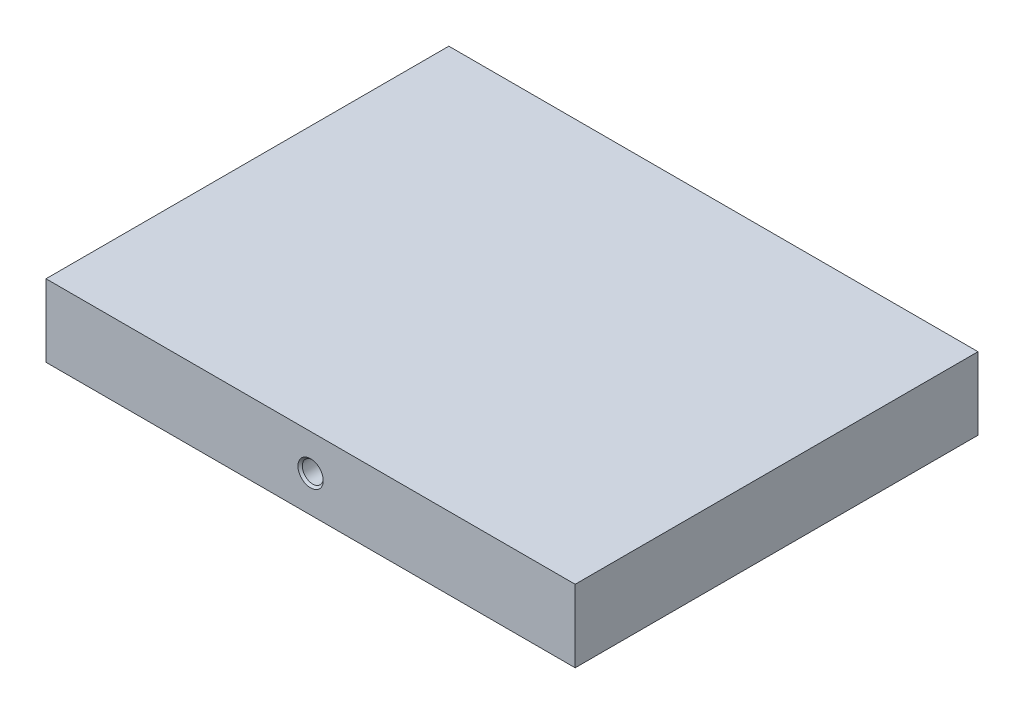
ISO-10303-21;
HEADER;
FILE_DESCRIPTION(('STEP AP214'),'2;1');
FILE_NAME('part.step','',(''),(''),'','','');
FILE_SCHEMA(('AUTOMOTIVE_DESIGN { 1 0 10303 214 1 1 1 1 }'));
ENDSEC;
DATA;
#1=APPLICATION_CONTEXT('core data for automotive mechanical design processes');
#2=APPLICATION_PROTOCOL_DEFINITION('international standard','automotive_design',2000,#1);
#3=PRODUCT_CONTEXT('',#1,'mechanical');
#4=PRODUCT('Part','Part','',(#3));
#5=PRODUCT_RELATED_PRODUCT_CATEGORY('part','',(#4));
#6=PRODUCT_DEFINITION_FORMATION('','',#4);
#7=PRODUCT_DEFINITION_CONTEXT('part definition',#1,'design');
#8=PRODUCT_DEFINITION('design','',#6,#7);
#9=PRODUCT_DEFINITION_SHAPE('','',#8);
#10=(LENGTH_UNIT() NAMED_UNIT(*) SI_UNIT(.MILLI.,.METRE.));
#11=(NAMED_UNIT(*) PLANE_ANGLE_UNIT() SI_UNIT($,.RADIAN.));
#12=(NAMED_UNIT(*) SI_UNIT($,.STERADIAN.) SOLID_ANGLE_UNIT());
#13=UNCERTAINTY_MEASURE_WITH_UNIT(LENGTH_MEASURE(1.E-05),#10,'distance_accuracy_value','');
#14=(GEOMETRIC_REPRESENTATION_CONTEXT(3) GLOBAL_UNCERTAINTY_ASSIGNED_CONTEXT((#13)) GLOBAL_UNIT_ASSIGNED_CONTEXT((#10,
#11,#12)) REPRESENTATION_CONTEXT('',''));
#15=CARTESIAN_POINT('',(0.,0.,0.));
#16=DIRECTION('',(0.,0.,1.));
#17=DIRECTION('',(1.,0.,0.));
#18=AXIS2_PLACEMENT_3D('',#15,#16,#17);
#19=CARTESIAN_POINT('',(-64.45,5.6,15.25));
#20=DIRECTION('',(1.,0.,0.));
#21=DIRECTION('',(0.,0.,-1.));
#22=AXIS2_PLACEMENT_3D('',#19,#20,#21);
#23=CYLINDRICAL_SURFACE('',#22,1.9);
#24=CARTESIAN_POINT('',(-64.45,5.6,15.25));
#25=DIRECTION('',(-1.,0.,0.));
#26=DIRECTION('',(0.,0.,1.));
#27=AXIS2_PLACEMENT_3D('',#24,#25,#26);
#28=CIRCLE('',#27,1.9);
#29=CARTESIAN_POINT('',(-64.45,5.6,17.15));
#30=VERTEX_POINT('',#29);
#31=EDGE_CURVE('E60',#30,#30,#28,.T.);
#32=ORIENTED_EDGE('',*,*,#31,.F.);
#33=EDGE_LOOP('',(#32));
#34=FACE_BOUND('',#33,.T.);
#35=CARTESIAN_POINT('',(-63.25,5.6,15.25));
#36=DIRECTION('',(-1.,0.,0.));
#37=DIRECTION('',(0.,0.,1.));
#38=AXIS2_PLACEMENT_3D('',#35,#36,#37);
#39=CIRCLE('',#38,1.9);
#40=CARTESIAN_POINT('',(-63.25,5.6,17.15));
#41=VERTEX_POINT('',#40);
#42=EDGE_CURVE('E11',#41,#41,#39,.T.);
#43=ORIENTED_EDGE('',*,*,#42,.T.);
#44=EDGE_LOOP('',(#43));
#45=FACE_BOUND('',#44,.T.);
#46=ADVANCED_FACE('F56',(#34,#45),#23,.T.);
#47=CARTESIAN_POINT('',(-64.45,5.6,15.25));
#48=DIRECTION('',(-1.,0.,0.));
#49=DIRECTION('',(0.,0.,1.));
#50=AXIS2_PLACEMENT_3D('',#47,#48,#49);
#51=PLANE('',#50);
#52=ORIENTED_EDGE('',*,*,#31,.T.);
#53=EDGE_LOOP('',(#52));
#54=FACE_BOUND('',#53,.T.);
#55=ADVANCED_FACE('F58',(#54),#51,.T.);
#56=CARTESIAN_POINT('',(-63.25,5.6,15.25));
#57=DIRECTION('',(-1.,0.,0.));
#58=DIRECTION('',(0.,0.,1.));
#59=AXIS2_PLACEMENT_3D('',#56,#57,#58);
#60=PLANE('',#59);
#61=ORIENTED_EDGE('',*,*,#42,.F.);
#62=EDGE_LOOP('',(#61));
#63=FACE_BOUND('',#62,.T.);
#64=ADVANCED_FACE('F75',(#63),#60,.F.);
#65=CLOSED_SHELL('',(#46,#55,#64));
#66=MANIFOLD_SOLID_BREP('B2',#65);
#67=CARTESIAN_POINT('',(-64.45,5.6,3.75000000000001));
#68=DIRECTION('',(1.,0.,0.));
#69=DIRECTION('',(0.,0.,-1.));
#70=AXIS2_PLACEMENT_3D('',#67,#68,#69);
#71=CYLINDRICAL_SURFACE('',#70,1.9);
#72=CARTESIAN_POINT('',(-64.45,5.6,3.75000000000001));
#73=DIRECTION('',(-1.,0.,0.));
#74=DIRECTION('',(0.,0.,1.));
#75=AXIS2_PLACEMENT_3D('',#72,#73,#74);
#76=CIRCLE('',#75,1.9);
#77=CARTESIAN_POINT('',(-64.45,5.6,5.65000000000001));
#78=VERTEX_POINT('',#77);
#79=EDGE_CURVE('E109',#78,#78,#76,.T.);
#80=ORIENTED_EDGE('',*,*,#79,.F.);
#81=EDGE_LOOP('',(#80));
#82=FACE_BOUND('',#81,.T.);
#83=CARTESIAN_POINT('',(-63.25,5.6,3.75000000000001));
#84=DIRECTION('',(-1.,0.,0.));
#85=DIRECTION('',(0.,0.,1.));
#86=AXIS2_PLACEMENT_3D('',#83,#84,#85);
#87=CIRCLE('',#86,1.9);
#88=CARTESIAN_POINT('',(-63.25,5.6,5.65000000000001));
#89=VERTEX_POINT('',#88);
#90=EDGE_CURVE('E55',#89,#89,#87,.T.);
#91=ORIENTED_EDGE('',*,*,#90,.T.);
#92=EDGE_LOOP('',(#91));
#93=FACE_BOUND('',#92,.T.);
#94=ADVANCED_FACE('F105',(#82,#93),#71,.T.);
#95=CARTESIAN_POINT('',(-64.45,5.6,3.75000000000001));
#96=DIRECTION('',(-1.,0.,0.));
#97=DIRECTION('',(0.,0.,1.));
#98=AXIS2_PLACEMENT_3D('',#95,#96,#97);
#99=PLANE('',#98);
#100=ORIENTED_EDGE('',*,*,#79,.T.);
#101=EDGE_LOOP('',(#100));
#102=FACE_BOUND('',#101,.T.);
#103=ADVANCED_FACE('F107',(#102),#99,.T.);
#104=CARTESIAN_POINT('',(-63.25,5.6,3.75000000000001));
#105=DIRECTION('',(-1.,0.,0.));
#106=DIRECTION('',(0.,0.,1.));
#107=AXIS2_PLACEMENT_3D('',#104,#105,#106);
#108=PLANE('',#107);
#109=ORIENTED_EDGE('',*,*,#90,.F.);
#110=EDGE_LOOP('',(#109));
#111=FACE_BOUND('',#110,.T.);
#112=ADVANCED_FACE('F124',(#111),#108,.F.);
#113=CLOSED_SHELL('',(#94,#103,#112));
#114=MANIFOLD_SOLID_BREP('B6',#113);
#115=CARTESIAN_POINT('',(-64.45,5.6,-7.74999999999999));
#116=DIRECTION('',(1.,0.,0.));
#117=DIRECTION('',(0.,0.,-1.));
#118=AXIS2_PLACEMENT_3D('',#115,#116,#117);
#119=CYLINDRICAL_SURFACE('',#118,1.9);
#120=CARTESIAN_POINT('',(-64.45,5.6,-7.74999999999999));
#121=DIRECTION('',(-1.,0.,0.));
#122=DIRECTION('',(0.,0.,1.));
#123=AXIS2_PLACEMENT_3D('',#120,#121,#122);
#124=CIRCLE('',#123,1.9);
#125=CARTESIAN_POINT('',(-64.45,5.6,-5.85));
#126=VERTEX_POINT('',#125);
#127=EDGE_CURVE('E158',#126,#126,#124,.T.);
#128=ORIENTED_EDGE('',*,*,#127,.F.);
#129=EDGE_LOOP('',(#128));
#130=FACE_BOUND('',#129,.T.);
#131=CARTESIAN_POINT('',(-63.25,5.6,-7.74999999999999));
#132=DIRECTION('',(-1.,0.,0.));
#133=DIRECTION('',(0.,0.,1.));
#134=AXIS2_PLACEMENT_3D('',#131,#132,#133);
#135=CIRCLE('',#134,1.9);
#136=CARTESIAN_POINT('',(-63.25,5.6,-5.85));
#137=VERTEX_POINT('',#136);
#138=EDGE_CURVE('E104',#137,#137,#135,.T.);
#139=ORIENTED_EDGE('',*,*,#138,.T.);
#140=EDGE_LOOP('',(#139));
#141=FACE_BOUND('',#140,.T.);
#142=ADVANCED_FACE('F154',(#130,#141),#119,.T.);
#143=CARTESIAN_POINT('',(-64.45,5.6,-7.74999999999999));
#144=DIRECTION('',(-1.,0.,0.));
#145=DIRECTION('',(0.,0.,1.));
#146=AXIS2_PLACEMENT_3D('',#143,#144,#145);
#147=PLANE('',#146);
#148=ORIENTED_EDGE('',*,*,#127,.T.);
#149=EDGE_LOOP('',(#148));
#150=FACE_BOUND('',#149,.T.);
#151=ADVANCED_FACE('F156',(#150),#147,.T.);
#152=CARTESIAN_POINT('',(-63.25,5.6,-7.74999999999999));
#153=DIRECTION('',(-1.,0.,0.));
#154=DIRECTION('',(0.,0.,1.));
#155=AXIS2_PLACEMENT_3D('',#152,#153,#154);
#156=PLANE('',#155);
#157=ORIENTED_EDGE('',*,*,#138,.F.);
#158=EDGE_LOOP('',(#157));
#159=FACE_BOUND('',#158,.T.);
#160=ADVANCED_FACE('F173',(#159),#156,.F.);
#161=CLOSED_SHELL('',(#142,#151,#160));
#162=MANIFOLD_SOLID_BREP('B50',#161);
#163=CARTESIAN_POINT('',(-64.45,5.6,-19.25));
#164=DIRECTION('',(1.,0.,0.));
#165=DIRECTION('',(0.,0.,-1.));
#166=AXIS2_PLACEMENT_3D('',#163,#164,#165);
#167=CYLINDRICAL_SURFACE('',#166,1.9);
#168=CARTESIAN_POINT('',(-64.45,5.6,-19.25));
#169=DIRECTION('',(-1.,0.,0.));
#170=DIRECTION('',(0.,0.,1.));
#171=AXIS2_PLACEMENT_3D('',#168,#169,#170);
#172=CIRCLE('',#171,1.9);
#173=CARTESIAN_POINT('',(-64.45,5.6,-17.35));
#174=VERTEX_POINT('',#173);
#175=EDGE_CURVE('E207',#174,#174,#172,.T.);
#176=ORIENTED_EDGE('',*,*,#175,.F.);
#177=EDGE_LOOP('',(#176));
#178=FACE_BOUND('',#177,.T.);
#179=CARTESIAN_POINT('',(-63.25,5.6,-19.25));
#180=DIRECTION('',(-1.,0.,0.));
#181=DIRECTION('',(0.,0.,1.));
#182=AXIS2_PLACEMENT_3D('',#179,#180,#181);
#183=CIRCLE('',#182,1.9);
#184=CARTESIAN_POINT('',(-63.25,5.6,-17.35));
#185=VERTEX_POINT('',#184);
#186=EDGE_CURVE('E153',#185,#185,#183,.T.);
#187=ORIENTED_EDGE('',*,*,#186,.T.);
#188=EDGE_LOOP('',(#187));
#189=FACE_BOUND('',#188,.T.);
#190=ADVANCED_FACE('F203',(#178,#189),#167,.T.);
#191=CARTESIAN_POINT('',(-64.45,5.6,-19.25));
#192=DIRECTION('',(-1.,0.,0.));
#193=DIRECTION('',(0.,0.,1.));
#194=AXIS2_PLACEMENT_3D('',#191,#192,#193);
#195=PLANE('',#194);
#196=ORIENTED_EDGE('',*,*,#175,.T.);
#197=EDGE_LOOP('',(#196));
#198=FACE_BOUND('',#197,.T.);
#199=ADVANCED_FACE('F205',(#198),#195,.T.);
#200=CARTESIAN_POINT('',(-63.25,5.6,-19.25));
#201=DIRECTION('',(-1.,0.,0.));
#202=DIRECTION('',(0.,0.,1.));
#203=AXIS2_PLACEMENT_3D('',#200,#201,#202);
#204=PLANE('',#203);
#205=ORIENTED_EDGE('',*,*,#186,.F.);
#206=EDGE_LOOP('',(#205));
#207=FACE_BOUND('',#206,.T.);
#208=ADVANCED_FACE('F222',(#207),#204,.F.);
#209=CLOSED_SHELL('',(#190,#199,#208));
#210=MANIFOLD_SOLID_BREP('B99',#209);
#211=CARTESIAN_POINT('',(-64.45,5.6,-30.75));
#212=DIRECTION('',(1.,0.,0.));
#213=DIRECTION('',(0.,0.,-1.));
#214=AXIS2_PLACEMENT_3D('',#211,#212,#213);
#215=CYLINDRICAL_SURFACE('',#214,1.9);
#216=CARTESIAN_POINT('',(-64.45,5.6,-30.75));
#217=DIRECTION('',(-1.,0.,0.));
#218=DIRECTION('',(0.,0.,1.));
#219=AXIS2_PLACEMENT_3D('',#216,#217,#218);
#220=CIRCLE('',#219,1.9);
#221=CARTESIAN_POINT('',(-64.45,5.6,-28.85));
#222=VERTEX_POINT('',#221);
#223=EDGE_CURVE('E202',#222,#222,#220,.T.);
#224=ORIENTED_EDGE('',*,*,#223,.F.);
#225=EDGE_LOOP('',(#224));
#226=FACE_BOUND('',#225,.T.);
#227=CARTESIAN_POINT('',(-63.25,5.6,-30.75));
#228=DIRECTION('',(-1.,0.,0.));
#229=DIRECTION('',(0.,0.,1.));
#230=AXIS2_PLACEMENT_3D('',#227,#228,#229);
#231=CIRCLE('',#230,1.9);
#232=CARTESIAN_POINT('',(-63.25,5.6,-28.85));
#233=VERTEX_POINT('',#232);
#234=EDGE_CURVE('E256',#233,#233,#231,.T.);
#235=ORIENTED_EDGE('',*,*,#234,.T.);
#236=EDGE_LOOP('',(#235));
#237=FACE_BOUND('',#236,.T.);
#238=ADVANCED_FACE('F253',(#226,#237),#215,.T.);
#239=CARTESIAN_POINT('',(-64.45,5.6,-30.75));
#240=DIRECTION('',(-1.,0.,0.));
#241=DIRECTION('',(0.,0.,1.));
#242=AXIS2_PLACEMENT_3D('',#239,#240,#241);
#243=PLANE('',#242);
#244=ORIENTED_EDGE('',*,*,#223,.T.);
#245=EDGE_LOOP('',(#244));
#246=FACE_BOUND('',#245,.T.);
#247=ADVANCED_FACE('F268',(#246),#243,.T.);
#248=CARTESIAN_POINT('',(-63.25,5.6,-30.75));
#249=DIRECTION('',(-1.,0.,0.));
#250=DIRECTION('',(0.,0.,1.));
#251=AXIS2_PLACEMENT_3D('',#248,#249,#250);
#252=PLANE('',#251);
#253=ORIENTED_EDGE('',*,*,#234,.F.);
#254=EDGE_LOOP('',(#253));
#255=FACE_BOUND('',#254,.T.);
#256=ADVANCED_FACE('F266',(#255),#252,.F.);
#257=CLOSED_SHELL('',(#238,#247,#256));
#258=MANIFOLD_SOLID_BREP('B148',#257);
#259=CARTESIAN_POINT('',(63.25,17.3,48.15));
#260=DIRECTION('',(-1.,0.,0.));
#261=DIRECTION('',(0.,0.,1.));
#262=AXIS2_PLACEMENT_3D('',#259,#260,#261);
#263=PLANE('',#262);
#264=DIRECTION('',(0.,0.,-1.));
#265=VECTOR('',#264,1.);
#266=CARTESIAN_POINT('',(63.25,0.,48.15));
#267=LINE('',#266,#265);
#268=CARTESIAN_POINT('',(63.25,0.,48.15));
#269=VERTEX_POINT('',#268);
#270=CARTESIAN_POINT('',(63.25,0.,-48.15));
#271=VERTEX_POINT('',#270);
#272=EDGE_CURVE('E460',#269,#271,#267,.T.);
#273=ORIENTED_EDGE('',*,*,#272,.T.);
#274=DIRECTION('',(0.,-1.,0.));
#275=VECTOR('',#274,1.);
#276=CARTESIAN_POINT('',(63.25,17.3,-48.15));
#277=LINE('',#276,#275);
#278=CARTESIAN_POINT('',(63.25,17.3,-48.15));
#279=VERTEX_POINT('',#278);
#280=EDGE_CURVE('E251',#279,#271,#277,.T.);
#281=ORIENTED_EDGE('',*,*,#280,.F.);
#282=DIRECTION('',(0.,0.,-1.));
#283=VECTOR('',#282,1.);
#284=CARTESIAN_POINT('',(63.25,17.3,48.15));
#285=LINE('',#284,#283);
#286=CARTESIAN_POINT('',(63.25,17.3,48.15));
#287=VERTEX_POINT('',#286);
#288=EDGE_CURVE('E461',#287,#279,#285,.T.);
#289=ORIENTED_EDGE('',*,*,#288,.F.);
#290=DIRECTION('',(0.,-1.,0.));
#291=VECTOR('',#290,1.);
#292=CARTESIAN_POINT('',(63.25,17.3,48.15));
#293=LINE('',#292,#291);
#294=EDGE_CURVE('E471',#287,#269,#293,.T.);
#295=ORIENTED_EDGE('',*,*,#294,.T.);
#296=EDGE_LOOP('',(#273,#281,#289,#295));
#297=FACE_BOUND('',#296,.T.);
#298=ADVANCED_FACE('F294',(#297),#263,.F.);
#299=CARTESIAN_POINT('',(-63.25,17.3,-48.15));
#300=DIRECTION('',(0.,0.,1.));
#301=DIRECTION('',(1.,0.,0.));
#302=AXIS2_PLACEMENT_3D('',#299,#300,#301);
#303=PLANE('',#302);
#304=DIRECTION('',(-1.,0.,0.));
#305=VECTOR('',#304,1.);
#306=CARTESIAN_POINT('',(-63.25,0.,-48.15));
#307=LINE('',#306,#305);
#308=CARTESIAN_POINT('',(-63.25,0.,-48.15));
#309=VERTEX_POINT('',#308);
#310=EDGE_CURVE('E475',#271,#309,#307,.T.);
#311=ORIENTED_EDGE('',*,*,#310,.T.);
#312=DIRECTION('',(0.,-1.,0.));
#313=VECTOR('',#312,1.);
#314=CARTESIAN_POINT('',(-63.25,17.3,-48.15));
#315=LINE('',#314,#313);
#316=CARTESIAN_POINT('',(-63.25,17.3,-48.15));
#317=VERTEX_POINT('',#316);
#318=EDGE_CURVE('E302',#317,#309,#315,.T.);
#319=ORIENTED_EDGE('',*,*,#318,.F.);
#320=DIRECTION('',(-1.,0.,0.));
#321=VECTOR('',#320,1.);
#322=CARTESIAN_POINT('',(-63.25,17.3,-48.15));
#323=LINE('',#322,#321);
#324=EDGE_CURVE('E346',#279,#317,#323,.T.);
#325=ORIENTED_EDGE('',*,*,#324,.F.);
#326=ORIENTED_EDGE('',*,*,#280,.T.);
#327=EDGE_LOOP('',(#311,#319,#325,#326));
#328=FACE_BOUND('',#327,.T.);
#329=ADVANCED_FACE('F511',(#328),#303,.F.);
#330=CARTESIAN_POINT('',(-63.25,17.3,48.15));
#331=DIRECTION('',(1.,0.,0.));
#332=DIRECTION('',(0.,0.,-1.));
#333=AXIS2_PLACEMENT_3D('',#330,#331,#332);
#334=PLANE('',#333);
#335=DIRECTION('',(0.,0.,-1.));
#336=VECTOR('',#335,1.);
#337=CARTESIAN_POINT('',(-63.25,7.35,22.75));
#338=LINE('',#337,#336);
#339=CARTESIAN_POINT('',(-63.25,7.35,31.75));
#340=VERTEX_POINT('',#339);
#341=CARTESIAN_POINT('',(-63.25,7.35,22.75));
#342=VERTEX_POINT('',#341);
#343=EDGE_CURVE('E426',#340,#342,#338,.T.);
#344=ORIENTED_EDGE('',*,*,#343,.F.);
#345=DIRECTION('',(0.,1.,0.));
#346=VECTOR('',#345,1.);
#347=CARTESIAN_POINT('',(-63.25,7.35,31.75));
#348=LINE('',#347,#346);
#349=CARTESIAN_POINT('',(-63.25,3.85,31.75));
#350=VERTEX_POINT('',#349);
#351=EDGE_CURVE('E309',#350,#340,#348,.T.);
#352=ORIENTED_EDGE('',*,*,#351,.F.);
#353=DIRECTION('',(0.,0.,1.));
#354=VECTOR('',#353,1.);
#355=CARTESIAN_POINT('',(-63.25,3.85,22.75));
#356=LINE('',#355,#354);
#357=CARTESIAN_POINT('',(-63.25,3.85,22.75));
#358=VERTEX_POINT('',#357);
#359=EDGE_CURVE('E411',#358,#350,#356,.T.);
#360=ORIENTED_EDGE('',*,*,#359,.F.);
#361=DIRECTION('',(0.,-1.,0.));
#362=VECTOR('',#361,1.);
#363=CARTESIAN_POINT('',(-63.25,7.35,22.75));
#364=LINE('',#363,#362);
#365=EDGE_CURVE('E430',#342,#358,#364,.T.);
#366=ORIENTED_EDGE('',*,*,#365,.F.);
#367=EDGE_LOOP('',(#344,#352,#360,#366));
#368=FACE_BOUND('',#367,.T.);
#369=DIRECTION('',(0.,0.,1.));
#370=VECTOR('',#369,1.);
#371=CARTESIAN_POINT('',(-63.25,0.,48.15));
#372=LINE('',#371,#370);
#373=CARTESIAN_POINT('',(-63.25,0.,48.15));
#374=VERTEX_POINT('',#373);
#375=EDGE_CURVE('E478',#309,#374,#372,.T.);
#376=ORIENTED_EDGE('',*,*,#375,.T.);
#377=DIRECTION('',(0.,-1.,0.));
#378=VECTOR('',#377,1.);
#379=CARTESIAN_POINT('',(-63.25,17.3,48.15));
#380=LINE('',#379,#378);
#381=CARTESIAN_POINT('',(-63.25,17.3,48.15));
#382=VERTEX_POINT('',#381);
#383=EDGE_CURVE('E485',#382,#374,#380,.T.);
#384=ORIENTED_EDGE('',*,*,#383,.F.);
#385=DIRECTION('',(0.,0.,1.));
#386=VECTOR('',#385,1.);
#387=CARTESIAN_POINT('',(-63.25,17.3,48.15));
#388=LINE('',#387,#386);
#389=EDGE_CURVE('E466',#317,#382,#388,.T.);
#390=ORIENTED_EDGE('',*,*,#389,.F.);
#391=ORIENTED_EDGE('',*,*,#318,.T.);
#392=EDGE_LOOP('',(#376,#384,#390,#391));
#393=FACE_BOUND('',#392,.T.);
#394=ADVANCED_FACE('F492',(#368,#393),#334,.F.);
#395=CARTESIAN_POINT('',(-63.25,17.3,48.15));
#396=DIRECTION('',(0.,0.,-1.));
#397=DIRECTION('',(-1.,0.,0.));
#398=AXIS2_PLACEMENT_3D('',#395,#396,#397);
#399=PLANE('',#398);
#400=CARTESIAN_POINT('',(0.,8.65,48.15));
#401=DIRECTION('',(0.,0.,1.));
#402=DIRECTION('',(1.,0.,0.));
#403=AXIS2_PLACEMENT_3D('',#400,#401,#402);
#404=CIRCLE('',#403,3.025);
#405=CARTESIAN_POINT('',(3.025,8.65,48.15));
#406=VERTEX_POINT('',#405);
#407=EDGE_CURVE('E440',#406,#406,#404,.T.);
#408=ORIENTED_EDGE('',*,*,#407,.F.);
#409=EDGE_LOOP('',(#408));
#410=FACE_BOUND('',#409,.T.);
#411=DIRECTION('',(1.,0.,0.));
#412=VECTOR('',#411,1.);
#413=CARTESIAN_POINT('',(-63.25,0.,48.15));
#414=LINE('',#413,#412);
#415=EDGE_CURVE('E339',#374,#269,#414,.T.);
#416=ORIENTED_EDGE('',*,*,#415,.T.);
#417=ORIENTED_EDGE('',*,*,#294,.F.);
#418=DIRECTION('',(1.,0.,0.));
#419=VECTOR('',#418,1.);
#420=CARTESIAN_POINT('',(-63.25,17.3,48.15));
#421=LINE('',#420,#419);
#422=EDGE_CURVE('E318',#382,#287,#421,.T.);
#423=ORIENTED_EDGE('',*,*,#422,.F.);
#424=ORIENTED_EDGE('',*,*,#383,.T.);
#425=EDGE_LOOP('',(#416,#417,#423,#424));
#426=FACE_BOUND('',#425,.T.);
#427=ADVANCED_FACE('F500',(#410,#426),#399,.F.);
#428=CARTESIAN_POINT('',(0.,17.3,0.));
#429=DIRECTION('',(0.,-1.,0.));
#430=DIRECTION('',(0.,0.,-1.));
#431=AXIS2_PLACEMENT_3D('',#428,#429,#430);
#432=PLANE('',#431);
#433=ORIENTED_EDGE('',*,*,#288,.T.);
#434=ORIENTED_EDGE('',*,*,#324,.T.);
#435=ORIENTED_EDGE('',*,*,#389,.T.);
#436=ORIENTED_EDGE('',*,*,#422,.T.);
#437=EDGE_LOOP('',(#433,#434,#435,#436));
#438=FACE_BOUND('',#437,.T.);
#439=ADVANCED_FACE('F502',(#438),#432,.F.);
#440=CARTESIAN_POINT('',(0.,0.,0.));
#441=DIRECTION('',(0.,-1.,0.));
#442=DIRECTION('',(0.,0.,-1.));
#443=AXIS2_PLACEMENT_3D('',#440,#441,#442);
#444=PLANE('',#443);
#445=CARTESIAN_POINT('',(37.5,0.,0.));
#446=DIRECTION('',(0.,-1.,0.));
#447=DIRECTION('',(0.,0.,-1.));
#448=AXIS2_PLACEMENT_3D('',#445,#446,#447);
#449=CIRCLE('',#448,2.025);
#450=CARTESIAN_POINT('',(37.5,0.,-2.02499999999999));
#451=VERTEX_POINT('',#450);
#452=EDGE_CURVE('E395',#451,#451,#449,.T.);
#453=ORIENTED_EDGE('',*,*,#452,.F.);
#454=EDGE_LOOP('',(#453));
#455=FACE_BOUND('',#454,.T.);
#456=CARTESIAN_POINT('',(-37.5,0.,0.));
#457=DIRECTION('',(0.,-1.,0.));
#458=DIRECTION('',(0.,0.,-1.));
#459=AXIS2_PLACEMENT_3D('',#456,#457,#458);
#460=CIRCLE('',#459,2.025);
#461=CARTESIAN_POINT('',(-37.5,0.,-2.025));
#462=VERTEX_POINT('',#461);
#463=EDGE_CURVE('E386',#462,#462,#460,.T.);
#464=ORIENTED_EDGE('',*,*,#463,.F.);
#465=EDGE_LOOP('',(#464));
#466=FACE_BOUND('',#465,.T.);
#467=ORIENTED_EDGE('',*,*,#272,.F.);
#468=ORIENTED_EDGE('',*,*,#415,.F.);
#469=ORIENTED_EDGE('',*,*,#375,.F.);
#470=ORIENTED_EDGE('',*,*,#310,.F.);
#471=EDGE_LOOP('',(#467,#468,#469,#470));
#472=FACE_BOUND('',#471,.T.);
#473=ADVANCED_FACE('F496',(#455,#466,#472),#444,.T.);
#474=CARTESIAN_POINT('',(0.,8.65,40.15));
#475=DIRECTION('',(0.,0.,1.));
#476=DIRECTION('',(1.,0.,0.));
#477=AXIS2_PLACEMENT_3D('',#474,#475,#476);
#478=CONICAL_SURFACE('',#477,2.5,1.02974425867665);
#479=CARTESIAN_POINT('',(0.,8.65,38.6478484524311));
#480=VERTEX_POINT('',#479);
#481=VERTEX_LOOP('',#480);
#482=FACE_BOUND('',#481,.T.);
#483=CARTESIAN_POINT('',(0.,8.65,40.15));
#484=DIRECTION('',(0.,0.,1.));
#485=DIRECTION('',(1.,0.,0.));
#486=AXIS2_PLACEMENT_3D('',#483,#484,#485);
#487=CIRCLE('',#486,2.5);
#488=CARTESIAN_POINT('',(2.5,8.65,40.15));
#489=VERTEX_POINT('',#488);
#490=EDGE_CURVE('E456',#489,#489,#487,.T.);
#491=ORIENTED_EDGE('',*,*,#490,.T.);
#492=EDGE_LOOP('',(#491));
#493=FACE_BOUND('',#492,.T.);
#494=ADVANCED_FACE('F541',(#482,#493),#478,.F.);
#495=CARTESIAN_POINT('',(0.,8.65,48.15));
#496=DIRECTION('',(0.,0.,1.));
#497=DIRECTION('',(1.,0.,0.));
#498=AXIS2_PLACEMENT_3D('',#495,#496,#497);
#499=CYLINDRICAL_SURFACE('',#498,2.5);
#500=ORIENTED_EDGE('',*,*,#490,.F.);
#501=EDGE_LOOP('',(#500));
#502=FACE_BOUND('',#501,.T.);
#503=CARTESIAN_POINT('',(0.,8.65,47.625));
#504=DIRECTION('',(0.,0.,1.));
#505=DIRECTION('',(1.,0.,0.));
#506=AXIS2_PLACEMENT_3D('',#503,#504,#505);
#507=CIRCLE('',#506,2.5);
#508=CARTESIAN_POINT('',(2.5,8.65,47.625));
#509=VERTEX_POINT('',#508);
#510=EDGE_CURVE('E452',#509,#509,#507,.T.);
#511=ORIENTED_EDGE('',*,*,#510,.T.);
#512=EDGE_LOOP('',(#511));
#513=FACE_BOUND('',#512,.T.);
#514=ADVANCED_FACE('F551',(#502,#513),#499,.F.);
#515=CARTESIAN_POINT('',(0.,8.65,48.15));
#516=DIRECTION('',(0.,0.,1.));
#517=DIRECTION('',(1.,0.,0.));
#518=AXIS2_PLACEMENT_3D('',#515,#516,#517);
#519=CONICAL_SURFACE('',#518,3.025,0.785398163397445);
#520=ORIENTED_EDGE('',*,*,#510,.F.);
#521=EDGE_LOOP('',(#520));
#522=FACE_BOUND('',#521,.T.);
#523=ORIENTED_EDGE('',*,*,#407,.T.);
#524=EDGE_LOOP('',(#523));
#525=FACE_BOUND('',#524,.T.);
#526=ADVANCED_FACE('F562',(#522,#525),#519,.F.);
#527=CARTESIAN_POINT('',(-58.25,7.35,31.75));
#528=DIRECTION('',(0.,0.,1.));
#529=DIRECTION('',(1.,0.,0.));
#530=AXIS2_PLACEMENT_3D('',#527,#528,#529);
#531=PLANE('',#530);
#532=ORIENTED_EDGE('',*,*,#351,.T.);
#533=DIRECTION('',(-1.,0.,0.));
#534=VECTOR('',#533,1.);
#535=CARTESIAN_POINT('',(-58.25,7.35,31.75));
#536=LINE('',#535,#534);
#537=CARTESIAN_POINT('',(-58.25,7.35,31.75));
#538=VERTEX_POINT('',#537);
#539=EDGE_CURVE('E423',#538,#340,#536,.T.);
#540=ORIENTED_EDGE('',*,*,#539,.F.);
#541=DIRECTION('',(0.,1.,0.));
#542=VECTOR('',#541,1.);
#543=CARTESIAN_POINT('',(-58.25,7.35,31.75));
#544=LINE('',#543,#542);
#545=CARTESIAN_POINT('',(-58.25,3.85,31.75));
#546=VERTEX_POINT('',#545);
#547=EDGE_CURVE('E406',#546,#538,#544,.T.);
#548=ORIENTED_EDGE('',*,*,#547,.F.);
#549=DIRECTION('',(-1.,0.,0.));
#550=VECTOR('',#549,1.);
#551=CARTESIAN_POINT('',(-58.25,3.85,31.75));
#552=LINE('',#551,#550);
#553=EDGE_CURVE('E437',#546,#350,#552,.T.);
#554=ORIENTED_EDGE('',*,*,#553,.T.);
#555=EDGE_LOOP('',(#532,#540,#548,#554));
#556=FACE_BOUND('',#555,.T.);
#557=ADVANCED_FACE('F573',(#556),#531,.F.);
#558=CARTESIAN_POINT('',(-58.25,3.85,22.75));
#559=DIRECTION('',(0.,-1.,0.));
#560=DIRECTION('',(0.,0.,-1.));
#561=AXIS2_PLACEMENT_3D('',#558,#559,#560);
#562=PLANE('',#561);
#563=ORIENTED_EDGE('',*,*,#359,.T.);
#564=ORIENTED_EDGE('',*,*,#553,.F.);
#565=DIRECTION('',(0.,0.,1.));
#566=VECTOR('',#565,1.);
#567=CARTESIAN_POINT('',(-58.25,3.85,22.75));
#568=LINE('',#567,#566);
#569=CARTESIAN_POINT('',(-58.25,3.85,22.75));
#570=VERTEX_POINT('',#569);
#571=EDGE_CURVE('E419',#570,#546,#568,.T.);
#572=ORIENTED_EDGE('',*,*,#571,.F.);
#573=DIRECTION('',(-1.,0.,0.));
#574=VECTOR('',#573,1.);
#575=CARTESIAN_POINT('',(-58.25,3.85,22.75));
#576=LINE('',#575,#574);
#577=EDGE_CURVE('E441',#570,#358,#576,.T.);
#578=ORIENTED_EDGE('',*,*,#577,.T.);
#579=EDGE_LOOP('',(#563,#564,#572,#578));
#580=FACE_BOUND('',#579,.T.);
#581=ADVANCED_FACE('F583',(#580),#562,.F.);
#582=CARTESIAN_POINT('',(-58.25,7.35,22.75));
#583=DIRECTION('',(0.,0.,-1.));
#584=DIRECTION('',(-1.,0.,0.));
#585=AXIS2_PLACEMENT_3D('',#582,#583,#584);
#586=PLANE('',#585);
#587=ORIENTED_EDGE('',*,*,#365,.T.);
#588=ORIENTED_EDGE('',*,*,#577,.F.);
#589=DIRECTION('',(0.,-1.,0.));
#590=VECTOR('',#589,1.);
#591=CARTESIAN_POINT('',(-58.25,7.35,22.75));
#592=LINE('',#591,#590);
#593=CARTESIAN_POINT('',(-58.25,7.35,22.75));
#594=VERTEX_POINT('',#593);
#595=EDGE_CURVE('E415',#594,#570,#592,.T.);
#596=ORIENTED_EDGE('',*,*,#595,.F.);
#597=DIRECTION('',(-1.,0.,0.));
#598=VECTOR('',#597,1.);
#599=CARTESIAN_POINT('',(-58.25,7.35,22.75));
#600=LINE('',#599,#598);
#601=EDGE_CURVE('E444',#594,#342,#600,.T.);
#602=ORIENTED_EDGE('',*,*,#601,.T.);
#603=EDGE_LOOP('',(#587,#588,#596,#602));
#604=FACE_BOUND('',#603,.T.);
#605=ADVANCED_FACE('F592',(#604),#586,.F.);
#606=CARTESIAN_POINT('',(-58.25,7.35,22.75));
#607=DIRECTION('',(0.,1.,0.));
#608=DIRECTION('',(0.,0.,1.));
#609=AXIS2_PLACEMENT_3D('',#606,#607,#608);
#610=PLANE('',#609);
#611=ORIENTED_EDGE('',*,*,#343,.T.);
#612=ORIENTED_EDGE('',*,*,#601,.F.);
#613=DIRECTION('',(0.,0.,-1.));
#614=VECTOR('',#613,1.);
#615=CARTESIAN_POINT('',(-58.25,7.35,22.75));
#616=LINE('',#615,#614);
#617=EDGE_CURVE('E410',#538,#594,#616,.T.);
#618=ORIENTED_EDGE('',*,*,#617,.F.);
#619=ORIENTED_EDGE('',*,*,#539,.T.);
#620=EDGE_LOOP('',(#611,#612,#618,#619));
#621=FACE_BOUND('',#620,.T.);
#622=ADVANCED_FACE('F602',(#621),#610,.F.);
#623=CARTESIAN_POINT('',(-58.25,0.,0.));
#624=DIRECTION('',(-1.,0.,0.));
#625=DIRECTION('',(0.,0.,1.));
#626=AXIS2_PLACEMENT_3D('',#623,#624,#625);
#627=PLANE('',#626);
#628=ORIENTED_EDGE('',*,*,#547,.T.);
#629=ORIENTED_EDGE('',*,*,#617,.T.);
#630=ORIENTED_EDGE('',*,*,#595,.T.);
#631=ORIENTED_EDGE('',*,*,#571,.T.);
#632=EDGE_LOOP('',(#628,#629,#630,#631));
#633=FACE_BOUND('',#632,.T.);
#634=ADVANCED_FACE('F612',(#633),#627,.T.);
#635=CARTESIAN_POINT('',(-37.5,5.1,0.));
#636=DIRECTION('',(0.,-1.,0.));
#637=DIRECTION('',(0.,0.,-1.));
#638=AXIS2_PLACEMENT_3D('',#635,#636,#637);
#639=CONICAL_SURFACE('',#638,1.65,1.02974425867665);
#640=CARTESIAN_POINT('',(-37.5,6.09142002139547,0.));
#641=VERTEX_POINT('',#640);
#642=VERTEX_LOOP('',#641);
#643=FACE_BOUND('',#642,.T.);
#644=CARTESIAN_POINT('',(-37.5,5.1,0.));
#645=DIRECTION('',(0.,-1.,0.));
#646=DIRECTION('',(0.,0.,-1.));
#647=AXIS2_PLACEMENT_3D('',#644,#645,#646);
#648=CIRCLE('',#647,1.65);
#649=CARTESIAN_POINT('',(-37.5,5.1,-1.65));
#650=VERTEX_POINT('',#649);
#651=EDGE_CURVE('E402',#650,#650,#648,.T.);
#652=ORIENTED_EDGE('',*,*,#651,.T.);
#653=EDGE_LOOP('',(#652));
#654=FACE_BOUND('',#653,.T.);
#655=ADVANCED_FACE('F621',(#643,#654),#639,.F.);
#656=CARTESIAN_POINT('',(-37.5,0.,0.));
#657=DIRECTION('',(0.,-1.,0.));
#658=DIRECTION('',(0.,0.,-1.));
#659=AXIS2_PLACEMENT_3D('',#656,#657,#658);
#660=CYLINDRICAL_SURFACE('',#659,1.65);
#661=ORIENTED_EDGE('',*,*,#651,.F.);
#662=EDGE_LOOP('',(#661));
#663=FACE_BOUND('',#662,.T.);
#664=CARTESIAN_POINT('',(-37.5,0.374999999999999,0.));
#665=DIRECTION('',(0.,-1.,0.));
#666=DIRECTION('',(0.,0.,-1.));
#667=AXIS2_PLACEMENT_3D('',#664,#665,#666);
#668=CIRCLE('',#667,1.65);
#669=CARTESIAN_POINT('',(-37.5,0.374999999999999,-1.65));
#670=VERTEX_POINT('',#669);
#671=EDGE_CURVE('E392',#670,#670,#668,.T.);
#672=ORIENTED_EDGE('',*,*,#671,.T.);
#673=EDGE_LOOP('',(#672));
#674=FACE_BOUND('',#673,.T.);
#675=ADVANCED_FACE('F630',(#663,#674),#660,.F.);
#676=CARTESIAN_POINT('',(-37.5,0.,0.));
#677=DIRECTION('',(0.,-1.,0.));
#678=DIRECTION('',(0.,0.,-1.));
#679=AXIS2_PLACEMENT_3D('',#676,#677,#678);
#680=CONICAL_SURFACE('',#679,2.025,0.785398163397451);
#681=ORIENTED_EDGE('',*,*,#671,.F.);
#682=EDGE_LOOP('',(#681));
#683=FACE_BOUND('',#682,.T.);
#684=ORIENTED_EDGE('',*,*,#463,.T.);
#685=EDGE_LOOP('',(#684));
#686=FACE_BOUND('',#685,.T.);
#687=ADVANCED_FACE('F379',(#683,#686),#680,.F.);
#688=CARTESIAN_POINT('',(37.5,5.1,0.));
#689=DIRECTION('',(0.,-1.,0.));
#690=DIRECTION('',(0.,0.,-1.));
#691=AXIS2_PLACEMENT_3D('',#688,#689,#690);
#692=CONICAL_SURFACE('',#691,1.65,1.02974425867665);
#693=CARTESIAN_POINT('',(37.5,6.09142002139547,0.));
#694=VERTEX_POINT('',#693);
#695=VERTEX_LOOP('',#694);
#696=FACE_BOUND('',#695,.T.);
#697=CARTESIAN_POINT('',(37.5,5.1,0.));
#698=DIRECTION('',(0.,-1.,0.));
#699=DIRECTION('',(0.,0.,-1.));
#700=AXIS2_PLACEMENT_3D('',#697,#698,#699);
#701=CIRCLE('',#700,1.65);
#702=CARTESIAN_POINT('',(37.5,5.1,-1.64999999999998));
#703=VERTEX_POINT('',#702);
#704=EDGE_CURVE('E383',#703,#703,#701,.T.);
#705=ORIENTED_EDGE('',*,*,#704,.T.);
#706=EDGE_LOOP('',(#705));
#707=FACE_BOUND('',#706,.T.);
#708=ADVANCED_FACE('F375',(#696,#707),#692,.F.);
#709=CARTESIAN_POINT('',(37.5,0.,0.));
#710=DIRECTION('',(0.,-1.,0.));
#711=DIRECTION('',(0.,0.,-1.));
#712=AXIS2_PLACEMENT_3D('',#709,#710,#711);
#713=CYLINDRICAL_SURFACE('',#712,1.65);
#714=ORIENTED_EDGE('',*,*,#704,.F.);
#715=EDGE_LOOP('',(#714));
#716=FACE_BOUND('',#715,.T.);
#717=CARTESIAN_POINT('',(37.5,0.374999999999999,0.));
#718=DIRECTION('',(0.,-1.,0.));
#719=DIRECTION('',(0.,0.,-1.));
#720=AXIS2_PLACEMENT_3D('',#717,#718,#719);
#721=CIRCLE('',#720,1.65);
#722=CARTESIAN_POINT('',(37.5,0.374999999999999,-1.64999999999998));
#723=VERTEX_POINT('',#722);
#724=EDGE_CURVE('E387',#723,#723,#721,.T.);
#725=ORIENTED_EDGE('',*,*,#724,.T.);
#726=EDGE_LOOP('',(#725));
#727=FACE_BOUND('',#726,.T.);
#728=ADVANCED_FACE('F378',(#716,#727),#713,.F.);
#729=CARTESIAN_POINT('',(37.5,0.,0.));
#730=DIRECTION('',(0.,-1.,0.));
#731=DIRECTION('',(0.,0.,-1.));
#732=AXIS2_PLACEMENT_3D('',#729,#730,#731);
#733=CONICAL_SURFACE('',#732,2.025,0.785398163397451);
#734=ORIENTED_EDGE('',*,*,#724,.F.);
#735=EDGE_LOOP('',(#734));
#736=FACE_BOUND('',#735,.T.);
#737=ORIENTED_EDGE('',*,*,#452,.T.);
#738=EDGE_LOOP('',(#737));
#739=FACE_BOUND('',#738,.T.);
#740=ADVANCED_FACE('F667',(#736,#739),#733,.F.);
#741=CLOSED_SHELL('',(#298,#329,#394,#427,#439,#473,#494,#514,#526,#557,#581,#605,#622,#634,
#655,#675,#687,#708,#728,#740));
#742=MANIFOLD_SOLID_BREP('B197',#741);
#743=ADVANCED_BREP_SHAPE_REPRESENTATION('',(#18,#66,#114,#162,#210,#258,#742),#14);
#744=SHAPE_DEFINITION_REPRESENTATION(#9,#743);
ENDSEC;
END-ISO-10303-21;
